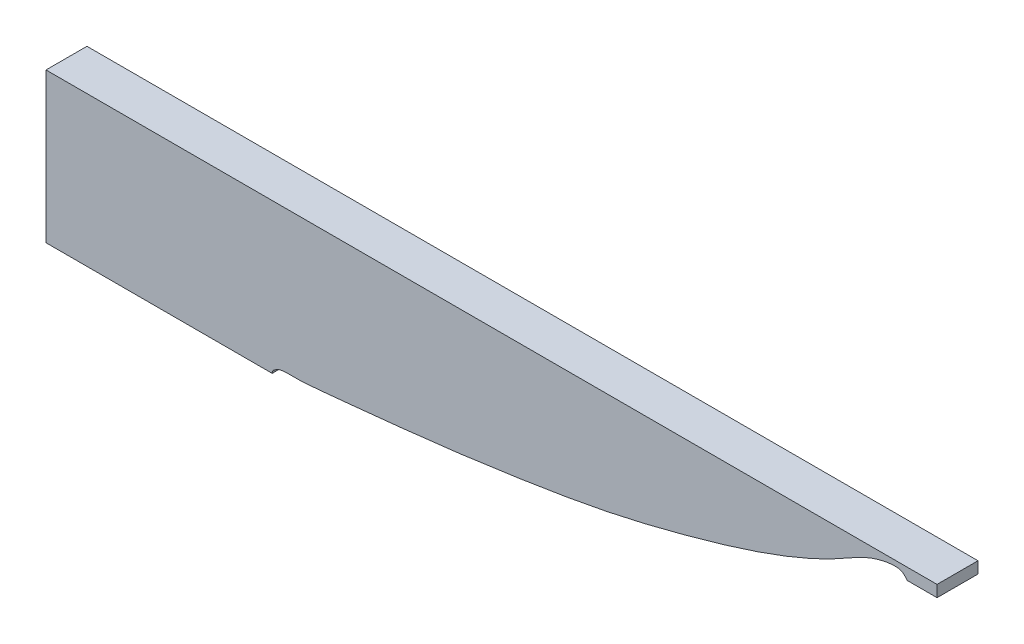
ISO-10303-21;
HEADER;
FILE_DESCRIPTION(('STEP AP214'),'2;1');
FILE_NAME('part.step','',(''),(''),'','','');
FILE_SCHEMA(('AUTOMOTIVE_DESIGN { 1 0 10303 214 1 1 1 1 }'));
ENDSEC;
DATA;
#1=APPLICATION_CONTEXT('core data for automotive mechanical design processes');
#2=APPLICATION_PROTOCOL_DEFINITION('international standard','automotive_design',2000,#1);
#3=PRODUCT_CONTEXT('',#1,'mechanical');
#4=PRODUCT('Part','Part','',(#3));
#5=PRODUCT_RELATED_PRODUCT_CATEGORY('part','',(#4));
#6=PRODUCT_DEFINITION_FORMATION('','',#4);
#7=PRODUCT_DEFINITION_CONTEXT('part definition',#1,'design');
#8=PRODUCT_DEFINITION('design','',#6,#7);
#9=PRODUCT_DEFINITION_SHAPE('','',#8);
#10=(LENGTH_UNIT() NAMED_UNIT(*) SI_UNIT(.MILLI.,.METRE.));
#11=(NAMED_UNIT(*) PLANE_ANGLE_UNIT() SI_UNIT($,.RADIAN.));
#12=(NAMED_UNIT(*) SI_UNIT($,.STERADIAN.) SOLID_ANGLE_UNIT());
#13=UNCERTAINTY_MEASURE_WITH_UNIT(LENGTH_MEASURE(1.E-05),#10,'distance_accuracy_value','');
#14=(GEOMETRIC_REPRESENTATION_CONTEXT(3) GLOBAL_UNCERTAINTY_ASSIGNED_CONTEXT((#13)) GLOBAL_UNIT_ASSIGNED_CONTEXT((#10,
#11,#12)) REPRESENTATION_CONTEXT('',''));
#15=CARTESIAN_POINT('',(0.,0.,0.));
#16=DIRECTION('',(0.,0.,1.));
#17=DIRECTION('',(1.,0.,0.));
#18=AXIS2_PLACEMENT_3D('',#15,#16,#17);
#19=CARTESIAN_POINT('',(-52.2009469096433,-26.9859590087651,364.));
#20=CARTESIAN_POINT('',(-52.2076643782362,-26.9008249066197,364.));
#21=CARTESIAN_POINT('',(-52.2086941789214,-26.8142159529312,364.));
#22=CARTESIAN_POINT('',(-52.1761840837474,-26.6463491252067,364.));
#23=CARTESIAN_POINT('',(-52.1435699097053,-26.565867128828,364.));
#24=CARTESIAN_POINT('',(-52.0478737519327,-26.4229851269886,364.));
#25=CARTESIAN_POINT('',(-51.9851315074762,-26.3646720260792,364.));
#26=CARTESIAN_POINT('',(-51.8537291223443,-26.2565926923012,364.));
#27=CARTESIAN_POINT('',(-51.7865893758686,-26.2039976291333,364.));
#28=CARTESIAN_POINT('',(-51.5828748400467,-26.0499421309684,364.));
#29=CARTESIAN_POINT('',(-51.4410393224546,-25.9545209352862,364.));
#30=CARTESIAN_POINT('',(-51.1437562383439,-25.7903210068856,364.));
#31=CARTESIAN_POINT('',(-50.9855664678437,-25.7226593943637,364.));
#32=CARTESIAN_POINT('',(-50.5049716863885,-25.5707810078762,364.));
#33=CARTESIAN_POINT('',(-50.1748740569212,-25.5269368696622,364.));
#34=CARTESIAN_POINT('',(-49.5080219460836,-25.4786417563224,364.));
#35=CARTESIAN_POINT('',(-49.1713157234657,-25.4749264661006,364.));
#36=CARTESIAN_POINT('',(-48.4997772064725,-25.4798822561327,364.));
#37=CARTESIAN_POINT('',(-48.1639561418959,-25.4876551580574,364.));
#38=CARTESIAN_POINT('',(-47.4924572665428,-25.4885592468479,364.));
#39=CARTESIAN_POINT('',(-47.1567675744337,-25.4829048034959,364.));
#40=CARTESIAN_POINT('',(-46.1498475654307,-25.4507055684768,364.));
#41=CARTESIAN_POINT('',(-45.4792809848992,-25.4076768953849,364.));
#42=CARTESIAN_POINT('',(-44.1412695498146,-25.2983938945127,364.));
#43=CARTESIAN_POINT('',(-43.4730717608353,-25.2349626686516,364.));
#44=CARTESIAN_POINT('',(-42.1366603404493,-25.1082725720015,364.));
#45=CARTESIAN_POINT('',(-41.4684526674652,-25.0449488775373,364.));
#46=CARTESIAN_POINT('',(-39.464190015059,-24.8510572458004,364.));
#47=CARTESIAN_POINT('',(-38.1284667371734,-24.7168806164181,364.));
#48=CARTESIAN_POINT('',(-31.4499466343279,-24.0449499355285,364.));
#49=CARTESIAN_POINT('',(-26.1071632718655,-23.5014581598206,364.));
#50=CARTESIAN_POINT('',(-18.1075676360533,-22.5660056416663,364.));
#51=CARTESIAN_POINT('',(-15.4437310619509,-22.2338403741593,364.));
#52=CARTESIAN_POINT('',(-10.1222376071295,-21.5228572524913,364.));
#53=CARTESIAN_POINT('',(-7.46439907946757,-21.1454107122791,364.));
#54=CARTESIAN_POINT('',(-2.15319722024847,-20.3567328692258,364.));
#55=CARTESIAN_POINT('',(0.500083871927196,-19.9457635507397,364.));
#56=CARTESIAN_POINT('',(5.79587609154246,-19.067815664953,364.));
#57=CARTESIAN_POINT('',(8.43859214387049,-18.6004356862189,364.));
#58=CARTESIAN_POINT('',(13.7071649848231,-17.573224081082,364.));
#59=CARTESIAN_POINT('',(16.3334825408524,-17.0113851140803,364.));
#60=CARTESIAN_POINT('',(21.5652701448604,-15.7956725328071,364.));
#61=CARTESIAN_POINT('',(24.1703068977647,-15.1437335534659,364.));
#62=CARTESIAN_POINT('',(29.3641519900412,-13.7739636479626,364.));
#63=CARTESIAN_POINT('',(31.9520009946092,-13.0560625476505,364.));
#64=CARTESIAN_POINT('',(37.1046529392994,-11.5405068350265,364.));
#65=CARTESIAN_POINT('',(39.6706164474642,-10.7444865759834,364.));
#66=CARTESIAN_POINT('',(43.4823857898468,-9.45961274862723,364.));
#67=CARTESIAN_POINT('',(44.7468735398583,-9.01551125780705,364.));
#68=CARTESIAN_POINT('',(47.2600944966439,-8.08648863345631,364.));
#69=CARTESIAN_POINT('',(48.5085488598233,-7.60084502287674,364.));
#70=CARTESIAN_POINT('',(50.9893147010406,-6.58773197447073,364.));
#71=CARTESIAN_POINT('',(52.222016073081,-6.06127274263022,364.));
#72=CARTESIAN_POINT('',(54.6660526064384,-4.95299494071464,364.));
#73=CARTESIAN_POINT('',(55.8779863398464,-4.37034022112138,364.));
#74=CARTESIAN_POINT('',(57.6689556813697,-3.43494085363436,364.));
#75=CARTESIAN_POINT('',(58.2611215379323,-3.11307643273593,364.));
#76=CARTESIAN_POINT('',(59.4402879964431,-2.45857080712047,364.));
#77=CARTESIAN_POINT('',(60.0266205536391,-2.12453579427306,364.));
#78=CARTESIAN_POINT('',(61.789054608586,-1.1296004237031,364.));
#79=CARTESIAN_POINT('',(62.9697310112455,-0.478245144563081,364.));
#80=CARTESIAN_POINT('',(64.8374516467542,0.297020373800566,364.));
#81=CARTESIAN_POINT('',(65.4772144302389,0.519578597777491,364.));
#82=CARTESIAN_POINT('',(66.4635631777564,0.797699531738181,364.));
#83=CARTESIAN_POINT('',(66.7977653232719,0.88164230533816,364.));
#84=CARTESIAN_POINT('',(67.4681547691546,1.02792445605697,364.));
#85=CARTESIAN_POINT('',(67.8047406347341,1.09002604287818,364.));
#86=CARTESIAN_POINT('',(68.4810493416685,1.18933557357607,364.));
#87=CARTESIAN_POINT('',(68.8206870310458,1.2272192456304,364.));
#88=CARTESIAN_POINT('',(69.3349089545761,1.24622874482237,364.));
#89=CARTESIAN_POINT('',(69.5071011835046,1.24633646032521,364.));
#90=CARTESIAN_POINT('',(69.8533450548019,1.23179641421545,364.));
#91=CARTESIAN_POINT('',(70.0256546077102,1.21659743412703,364.));
#92=CARTESIAN_POINT('',(70.3648711414067,1.15775425499039,364.));
#93=CARTESIAN_POINT('',(70.5345970729785,1.11271538482279,364.));
#94=CARTESIAN_POINT('',(70.8514927187138,0.974023223940351,364.));
#95=CARTESIAN_POINT('',(70.9944060412548,0.877911462483317,364.));
#96=CARTESIAN_POINT('',(71.2621488783253,0.655380294837213,364.));
#97=CARTESIAN_POINT('',(71.3835556524825,0.531296262824329,364.));
#98=CARTESIAN_POINT('',(71.5709954824348,0.350651163979292,364.));
#99=CARTESIAN_POINT('',(71.6337396758029,0.290707881710825,364.));
#100=CARTESIAN_POINT('',(71.7474068516063,0.15866456602323,364.));
#101=CARTESIAN_POINT('',(71.7953565909168,0.0846681168132786,364.));
#102=CARTESIAN_POINT('',(71.8181141242803,1.6716703433832E-13,364.));
#103=B_SPLINE_CURVE_WITH_KNOTS('',3,(#19,#20,#21,#22,#23,#24,#25,#26,#27,#28,#29,#30,#31,#32,
#33,#34,#35,#36,#37,#38,#39,#40,#41,#42,#43,#44,#45,#46,#47,#48,#49,#50,#51,#52,#53,#54,#55,#56,
#57,#58,#59,#60,#61,#62,#63,#64,#65,#66,#67,#68,#69,#70,#71,#72,#73,#74,#75,#76,#77,#78,#79,#80,
#81,#82,#83,#84,#85,#86,#87,#88,#89,#90,#91,#92,#93,#94,#95,#96,#97,#98,#99,#100,#101,#102),
.UNSPECIFIED.,.F.,.F.,(4,2,2,2,2,2,2,2,2,2,2,2,2,2,2,2,2,2,2,2,2,2,2,2,2,2,2,2,2,2,2,2,2,2,2,2,
2,2,2,2,2,4),(0.,0.00195312499999989,0.00390625,0.005859375,0.0078125,0.01171875,
0.0156249999999999,0.0234374999999999,0.0312499999999999,0.0390625,0.046875,0.0625,0.078125,
0.09375,0.125,0.25,0.3125,0.374999999999999,0.437499999999999,0.499999999999999,
0.562499999999999,0.624999999999999,0.687499999999999,0.749999999999999,0.781249999999999,
0.812499999999999,0.843749999999999,0.874999999999999,0.890624999999999,0.906249999999999,
0.9375,0.953124999999999,0.9609375,0.96875,0.9765625,0.98046875,0.984375,0.98828125,0.9921875,
0.99609375,0.998046875,1.),.UNSPECIFIED.);
#104=DIRECTION('',(0.,0.,-1.));
#105=VECTOR('',#104,1.);
#106=SURFACE_OF_LINEAR_EXTRUSION('',#103,#105);
#107=CARTESIAN_POINT('',(-52.2009469096433,-26.9859590087651,356.));
#108=CARTESIAN_POINT('',(-52.2076643782362,-26.9008249066197,356.));
#109=CARTESIAN_POINT('',(-52.2086941789214,-26.8142159529312,356.));
#110=CARTESIAN_POINT('',(-52.1761840837474,-26.6463491252067,356.));
#111=CARTESIAN_POINT('',(-52.1435699097053,-26.565867128828,356.));
#112=CARTESIAN_POINT('',(-52.0478737519327,-26.4229851269886,356.));
#113=CARTESIAN_POINT('',(-51.9851315074762,-26.3646720260792,356.));
#114=CARTESIAN_POINT('',(-51.8537291223443,-26.2565926923012,356.));
#115=CARTESIAN_POINT('',(-51.7865893758686,-26.2039976291333,356.));
#116=CARTESIAN_POINT('',(-51.5828748400467,-26.0499421309684,356.));
#117=CARTESIAN_POINT('',(-51.4410393224546,-25.9545209352862,356.));
#118=CARTESIAN_POINT('',(-51.1437562383439,-25.7903210068856,356.));
#119=CARTESIAN_POINT('',(-50.9855664678437,-25.7226593943637,356.));
#120=CARTESIAN_POINT('',(-50.5049716863885,-25.5707810078762,356.));
#121=CARTESIAN_POINT('',(-50.1748740569212,-25.5269368696622,356.));
#122=CARTESIAN_POINT('',(-49.5080219460836,-25.4786417563224,356.));
#123=CARTESIAN_POINT('',(-49.1713157234657,-25.4749264661006,356.));
#124=CARTESIAN_POINT('',(-48.4997772064725,-25.4798822561327,356.));
#125=CARTESIAN_POINT('',(-48.1639561418959,-25.4876551580574,356.));
#126=CARTESIAN_POINT('',(-47.4924572665428,-25.4885592468479,356.));
#127=CARTESIAN_POINT('',(-47.1567675744337,-25.4829048034959,356.));
#128=CARTESIAN_POINT('',(-46.1498475654307,-25.4507055684768,356.));
#129=CARTESIAN_POINT('',(-45.4792809848992,-25.4076768953849,356.));
#130=CARTESIAN_POINT('',(-44.1412695498146,-25.2983938945127,356.));
#131=CARTESIAN_POINT('',(-43.4730717608353,-25.2349626686516,356.));
#132=CARTESIAN_POINT('',(-42.1366603404493,-25.1082725720015,356.));
#133=CARTESIAN_POINT('',(-41.4684526674652,-25.0449488775373,356.));
#134=CARTESIAN_POINT('',(-39.464190015059,-24.8510572458004,356.));
#135=CARTESIAN_POINT('',(-38.1284667371734,-24.7168806164181,356.));
#136=CARTESIAN_POINT('',(-31.4499466343279,-24.0449499355285,356.));
#137=CARTESIAN_POINT('',(-26.1071632718655,-23.5014581598206,356.));
#138=CARTESIAN_POINT('',(-18.1075676360533,-22.5660056416663,356.));
#139=CARTESIAN_POINT('',(-15.4437310619509,-22.2338403741593,356.));
#140=CARTESIAN_POINT('',(-10.1222376071295,-21.5228572524913,356.));
#141=CARTESIAN_POINT('',(-7.46439907946757,-21.1454107122791,356.));
#142=CARTESIAN_POINT('',(-2.15319722024847,-20.3567328692258,356.));
#143=CARTESIAN_POINT('',(0.500083871927196,-19.9457635507397,356.));
#144=CARTESIAN_POINT('',(5.79587609154246,-19.067815664953,356.));
#145=CARTESIAN_POINT('',(8.43859214387049,-18.6004356862189,356.));
#146=CARTESIAN_POINT('',(13.7071649848231,-17.573224081082,356.));
#147=CARTESIAN_POINT('',(16.3334825408524,-17.0113851140803,356.));
#148=CARTESIAN_POINT('',(21.5652701448604,-15.7956725328071,356.));
#149=CARTESIAN_POINT('',(24.1703068977647,-15.1437335534659,356.));
#150=CARTESIAN_POINT('',(29.3641519900412,-13.7739636479626,356.));
#151=CARTESIAN_POINT('',(31.9520009946092,-13.0560625476505,356.));
#152=CARTESIAN_POINT('',(37.1046529392994,-11.5405068350265,356.));
#153=CARTESIAN_POINT('',(39.6706164474642,-10.7444865759834,356.));
#154=CARTESIAN_POINT('',(43.4823857898468,-9.45961274862723,356.));
#155=CARTESIAN_POINT('',(44.7468735398583,-9.01551125780705,356.));
#156=CARTESIAN_POINT('',(47.2600944966439,-8.08648863345631,356.));
#157=CARTESIAN_POINT('',(48.5085488598233,-7.60084502287674,356.));
#158=CARTESIAN_POINT('',(50.9893147010406,-6.58773197447073,356.));
#159=CARTESIAN_POINT('',(52.222016073081,-6.06127274263022,356.));
#160=CARTESIAN_POINT('',(54.6660526064384,-4.95299494071464,356.));
#161=CARTESIAN_POINT('',(55.8779863398464,-4.37034022112138,356.));
#162=CARTESIAN_POINT('',(57.6689556813697,-3.43494085363436,356.));
#163=CARTESIAN_POINT('',(58.2611215379323,-3.11307643273593,356.));
#164=CARTESIAN_POINT('',(59.4402879964431,-2.45857080712047,356.));
#165=CARTESIAN_POINT('',(60.0266205536391,-2.12453579427306,356.));
#166=CARTESIAN_POINT('',(61.789054608586,-1.1296004237031,356.));
#167=CARTESIAN_POINT('',(62.9697310112455,-0.478245144563081,356.));
#168=CARTESIAN_POINT('',(64.8374516467542,0.297020373800566,356.));
#169=CARTESIAN_POINT('',(65.4772144302389,0.519578597777491,356.));
#170=CARTESIAN_POINT('',(66.4635631777564,0.797699531738181,356.));
#171=CARTESIAN_POINT('',(66.7977653232719,0.88164230533816,356.));
#172=CARTESIAN_POINT('',(67.4681547691546,1.02792445605697,356.));
#173=CARTESIAN_POINT('',(67.8047406347341,1.09002604287818,356.));
#174=CARTESIAN_POINT('',(68.4810493416685,1.18933557357607,356.));
#175=CARTESIAN_POINT('',(68.8206870310458,1.2272192456304,356.));
#176=CARTESIAN_POINT('',(69.3349089545761,1.24622874482237,356.));
#177=CARTESIAN_POINT('',(69.5071011835046,1.24633646032521,356.));
#178=CARTESIAN_POINT('',(69.8533450548019,1.23179641421545,356.));
#179=CARTESIAN_POINT('',(70.0256546077102,1.21659743412703,356.));
#180=CARTESIAN_POINT('',(70.3648711414067,1.15775425499039,356.));
#181=CARTESIAN_POINT('',(70.5345970729785,1.11271538482279,356.));
#182=CARTESIAN_POINT('',(70.8514927187138,0.974023223940351,356.));
#183=CARTESIAN_POINT('',(70.9944060412548,0.877911462483317,356.));
#184=CARTESIAN_POINT('',(71.2621488783253,0.655380294837213,356.));
#185=CARTESIAN_POINT('',(71.3835556524825,0.531296262824329,356.));
#186=CARTESIAN_POINT('',(71.5709954824348,0.350651163979292,356.));
#187=CARTESIAN_POINT('',(71.6337396758029,0.290707881710825,356.));
#188=CARTESIAN_POINT('',(71.7474068516063,0.15866456602323,356.));
#189=CARTESIAN_POINT('',(71.7953565909168,0.0846681168132786,356.));
#190=CARTESIAN_POINT('',(71.8181141242803,1.6716703433832E-13,356.));
#191=B_SPLINE_CURVE_WITH_KNOTS('',3,(#107,#108,#109,#110,#111,#112,#113,#114,#115,#116,#117,
#118,#119,#120,#121,#122,#123,#124,#125,#126,#127,#128,#129,#130,#131,#132,#133,#134,#135,#136,
#137,#138,#139,#140,#141,#142,#143,#144,#145,#146,#147,#148,#149,#150,#151,#152,#153,#154,#155,
#156,#157,#158,#159,#160,#161,#162,#163,#164,#165,#166,#167,#168,#169,#170,#171,#172,#173,#174,
#175,#176,#177,#178,#179,#180,#181,#182,#183,#184,#185,#186,#187,#188,#189,#190),.UNSPECIFIED.,
.F.,.F.,(4,2,2,2,2,2,2,2,2,2,2,2,2,2,2,2,2,2,2,2,2,2,2,2,2,2,2,2,2,2,2,2,2,2,2,2,2,2,2,2,2,4),
(0.,0.00195312499999989,0.00390625,0.005859375,0.0078125,0.01171875,0.0156249999999999,
0.0234374999999999,0.0312499999999999,0.0390625,0.046875,0.0625,0.078125,0.09375,0.125,0.25,
0.3125,0.374999999999999,0.437499999999999,0.499999999999999,0.562499999999999,
0.624999999999999,0.687499999999999,0.749999999999999,0.781249999999999,0.812499999999999,
0.843749999999999,0.874999999999999,0.890624999999999,0.906249999999999,0.9375,
0.953124999999999,0.9609375,0.96875,0.9765625,0.98046875,0.984375,0.98828125,0.9921875,
0.99609375,0.998046875,1.),.UNSPECIFIED.);
#192=CARTESIAN_POINT('',(-52.2009469096433,-26.9859590087653,356.));
#193=VERTEX_POINT('',#192);
#194=CARTESIAN_POINT('',(71.81811412428,0.,356.));
#195=VERTEX_POINT('',#194);
#196=EDGE_CURVE('E208',#193,#195,#191,.T.);
#197=ORIENTED_EDGE('',*,*,#196,.T.);
#198=DIRECTION('',(0.,0.,-1.));
#199=VECTOR('',#198,1.);
#200=CARTESIAN_POINT('',(71.81811412428,0.,364.));
#201=LINE('',#200,#199);
#202=CARTESIAN_POINT('',(71.81811412428,0.,364.));
#203=VERTEX_POINT('',#202);
#204=EDGE_CURVE('E11',#203,#195,#201,.T.);
#205=ORIENTED_EDGE('',*,*,#204,.F.);
#206=CARTESIAN_POINT('',(71.8181141242803,1.6716703433832E-13,364.));
#207=CARTESIAN_POINT('',(71.7953565909168,0.0846681168132786,364.));
#208=CARTESIAN_POINT('',(71.7474068516063,0.15866456602323,364.));
#209=CARTESIAN_POINT('',(71.6337396758029,0.290707881710825,364.));
#210=CARTESIAN_POINT('',(71.5709954824348,0.350651163979292,364.));
#211=CARTESIAN_POINT('',(71.3835556524825,0.531296262824329,364.));
#212=CARTESIAN_POINT('',(71.2621488783253,0.655380294837213,364.));
#213=CARTESIAN_POINT('',(70.9944060412548,0.877911462483317,364.));
#214=CARTESIAN_POINT('',(70.8514927187138,0.974023223940351,364.));
#215=CARTESIAN_POINT('',(70.5345970729785,1.11271538482279,364.));
#216=CARTESIAN_POINT('',(70.3648711414067,1.15775425499039,364.));
#217=CARTESIAN_POINT('',(70.0256546077102,1.21659743412703,364.));
#218=CARTESIAN_POINT('',(69.8533450548019,1.23179641421545,364.));
#219=CARTESIAN_POINT('',(69.5071011835046,1.24633646032521,364.));
#220=CARTESIAN_POINT('',(69.3349089545761,1.24622874482237,364.));
#221=CARTESIAN_POINT('',(68.8206870310458,1.2272192456304,364.));
#222=CARTESIAN_POINT('',(68.4810493416685,1.18933557357607,364.));
#223=CARTESIAN_POINT('',(67.8047406347341,1.09002604287818,364.));
#224=CARTESIAN_POINT('',(67.4681547691546,1.02792445605697,364.));
#225=CARTESIAN_POINT('',(66.7977653232719,0.88164230533816,364.));
#226=CARTESIAN_POINT('',(66.4635631777564,0.797699531738181,364.));
#227=CARTESIAN_POINT('',(65.4772144302389,0.519578597777491,364.));
#228=CARTESIAN_POINT('',(64.8374516467542,0.297020373800566,364.));
#229=CARTESIAN_POINT('',(62.9697310112455,-0.478245144563081,364.));
#230=CARTESIAN_POINT('',(61.789054608586,-1.1296004237031,364.));
#231=CARTESIAN_POINT('',(60.0266205536391,-2.12453579427306,364.));
#232=CARTESIAN_POINT('',(59.4402879964431,-2.45857080712047,364.));
#233=CARTESIAN_POINT('',(58.2611215379323,-3.11307643273593,364.));
#234=CARTESIAN_POINT('',(57.6689556813697,-3.43494085363436,364.));
#235=CARTESIAN_POINT('',(55.8779863398464,-4.37034022112138,364.));
#236=CARTESIAN_POINT('',(54.6660526064384,-4.95299494071464,364.));
#237=CARTESIAN_POINT('',(52.222016073081,-6.06127274263022,364.));
#238=CARTESIAN_POINT('',(50.9893147010406,-6.58773197447073,364.));
#239=CARTESIAN_POINT('',(48.5085488598233,-7.60084502287674,364.));
#240=CARTESIAN_POINT('',(47.2600944966439,-8.08648863345631,364.));
#241=CARTESIAN_POINT('',(44.7468735398583,-9.01551125780705,364.));
#242=CARTESIAN_POINT('',(43.4823857898468,-9.45961274862723,364.));
#243=CARTESIAN_POINT('',(39.6706164474642,-10.7444865759834,364.));
#244=CARTESIAN_POINT('',(37.1046529392994,-11.5405068350265,364.));
#245=CARTESIAN_POINT('',(31.9520009946092,-13.0560625476505,364.));
#246=CARTESIAN_POINT('',(29.3641519900412,-13.7739636479626,364.));
#247=CARTESIAN_POINT('',(24.1703068977647,-15.1437335534659,364.));
#248=CARTESIAN_POINT('',(21.5652701448604,-15.7956725328071,364.));
#249=CARTESIAN_POINT('',(16.3334825408524,-17.0113851140803,364.));
#250=CARTESIAN_POINT('',(13.7071649848231,-17.573224081082,364.));
#251=CARTESIAN_POINT('',(8.43859214387049,-18.6004356862189,364.));
#252=CARTESIAN_POINT('',(5.79587609154246,-19.067815664953,364.));
#253=CARTESIAN_POINT('',(0.500083871927196,-19.9457635507397,364.));
#254=CARTESIAN_POINT('',(-2.15319722024847,-20.3567328692258,364.));
#255=CARTESIAN_POINT('',(-7.46439907946757,-21.1454107122791,364.));
#256=CARTESIAN_POINT('',(-10.1222376071295,-21.5228572524913,364.));
#257=CARTESIAN_POINT('',(-15.4437310619509,-22.2338403741593,364.));
#258=CARTESIAN_POINT('',(-18.1075676360533,-22.5660056416663,364.));
#259=CARTESIAN_POINT('',(-26.1071632718655,-23.5014581598206,364.));
#260=CARTESIAN_POINT('',(-31.4499466343279,-24.0449499355285,364.));
#261=CARTESIAN_POINT('',(-38.1284667371734,-24.7168806164181,364.));
#262=CARTESIAN_POINT('',(-39.464190015059,-24.8510572458004,364.));
#263=CARTESIAN_POINT('',(-41.4684526674652,-25.0449488775373,364.));
#264=CARTESIAN_POINT('',(-42.1366603404493,-25.1082725720015,364.));
#265=CARTESIAN_POINT('',(-43.4730717608353,-25.2349626686516,364.));
#266=CARTESIAN_POINT('',(-44.1412695498146,-25.2983938945127,364.));
#267=CARTESIAN_POINT('',(-45.4792809848992,-25.4076768953849,364.));
#268=CARTESIAN_POINT('',(-46.1498475654307,-25.4507055684768,364.));
#269=CARTESIAN_POINT('',(-47.1567675744337,-25.4829048034959,364.));
#270=CARTESIAN_POINT('',(-47.4924572665428,-25.4885592468479,364.));
#271=CARTESIAN_POINT('',(-48.1639561418959,-25.4876551580574,364.));
#272=CARTESIAN_POINT('',(-48.4997772064725,-25.4798822561327,364.));
#273=CARTESIAN_POINT('',(-49.1713157234657,-25.4749264661006,364.));
#274=CARTESIAN_POINT('',(-49.5080219460836,-25.4786417563224,364.));
#275=CARTESIAN_POINT('',(-50.1748740569212,-25.5269368696622,364.));
#276=CARTESIAN_POINT('',(-50.5049716863885,-25.5707810078762,364.));
#277=CARTESIAN_POINT('',(-50.9855664678437,-25.7226593943637,364.));
#278=CARTESIAN_POINT('',(-51.1437562383439,-25.7903210068856,364.));
#279=CARTESIAN_POINT('',(-51.4410393224546,-25.9545209352862,364.));
#280=CARTESIAN_POINT('',(-51.5828748400467,-26.0499421309684,364.));
#281=CARTESIAN_POINT('',(-51.7865893758686,-26.2039976291333,364.));
#282=CARTESIAN_POINT('',(-51.8537291223443,-26.2565926923012,364.));
#283=CARTESIAN_POINT('',(-51.9851315074762,-26.3646720260792,364.));
#284=CARTESIAN_POINT('',(-52.0478737519327,-26.4229851269886,364.));
#285=CARTESIAN_POINT('',(-52.1435699097053,-26.565867128828,364.));
#286=CARTESIAN_POINT('',(-52.1761840837474,-26.6463491252067,364.));
#287=CARTESIAN_POINT('',(-52.2086941789214,-26.8142159529312,364.));
#288=CARTESIAN_POINT('',(-52.2076643782362,-26.9008249066197,364.));
#289=CARTESIAN_POINT('',(-52.2009469096433,-26.9859590087651,364.));
#290=B_SPLINE_CURVE_WITH_KNOTS('',3,(#206,#207,#208,#209,#210,#211,#212,#213,#214,#215,#216,
#217,#218,#219,#220,#221,#222,#223,#224,#225,#226,#227,#228,#229,#230,#231,#232,#233,#234,#235,
#236,#237,#238,#239,#240,#241,#242,#243,#244,#245,#246,#247,#248,#249,#250,#251,#252,#253,#254,
#255,#256,#257,#258,#259,#260,#261,#262,#263,#264,#265,#266,#267,#268,#269,#270,#271,#272,#273,
#274,#275,#276,#277,#278,#279,#280,#281,#282,#283,#284,#285,#286,#287,#288,#289),.UNSPECIFIED.,
.F.,.F.,(4,2,2,2,2,2,2,2,2,2,2,2,2,2,2,2,2,2,2,2,2,2,2,2,2,2,2,2,2,2,2,2,2,2,2,2,2,2,2,2,2,4),
(0.,0.00195312499999989,0.00390624999999989,0.00781249999999989,0.01171875,0.015625,
0.0195312500000001,0.0234375000000001,0.0312500000000002,0.0390625000000004,0.0468750000000006,
0.0625000000000004,0.0937500000000007,0.109375000000001,0.125000000000001,0.156250000000001,
0.187500000000001,0.218750000000001,0.250000000000001,0.312500000000001,0.375000000000001,
0.437500000000001,0.500000000000001,0.562500000000001,0.625000000000001,0.6875,0.75,0.875,
0.90625,0.921875,0.9375,0.953125,0.9609375,0.96875,0.9765625,0.984375,0.98828125,0.9921875,
0.994140625,0.99609375,0.998046875,1.),.UNSPECIFIED.);
#291=CARTESIAN_POINT('',(-52.2009469096433,-26.9859590087653,364.));
#292=VERTEX_POINT('',#291);
#293=EDGE_CURVE('E191',#292,#203,#290,.F.);
#294=ORIENTED_EDGE('',*,*,#293,.F.);
#295=DIRECTION('',(0.,0.,-1.));
#296=VECTOR('',#295,1.);
#297=CARTESIAN_POINT('',(-52.2009469096433,-26.9859590087653,364.));
#298=LINE('',#297,#296);
#299=EDGE_CURVE('E116',#292,#193,#298,.T.);
#300=ORIENTED_EDGE('',*,*,#299,.T.);
#301=EDGE_LOOP('',(#197,#205,#294,#300));
#302=FACE_BOUND('',#301,.T.);
#303=ADVANCED_FACE('F30',(#302),#106,.F.);
#304=CARTESIAN_POINT('',(71.81811412428,0.,364.));
#305=DIRECTION('',(0.,1.,0.));
#306=DIRECTION('',(-1.,0.,0.));
#307=AXIS2_PLACEMENT_3D('',#304,#305,#306);
#308=PLANE('',#307);
#309=DIRECTION('',(1.,0.,0.));
#310=VECTOR('',#309,1.);
#311=CARTESIAN_POINT('',(71.81811412428,0.,356.));
#312=LINE('',#311,#310);
#313=CARTESIAN_POINT('',(77.6655379830616,0.,356.));
#314=VERTEX_POINT('',#313);
#315=EDGE_CURVE('E161',#195,#314,#312,.T.);
#316=ORIENTED_EDGE('',*,*,#315,.T.);
#317=DIRECTION('',(0.,0.,-1.));
#318=VECTOR('',#317,1.);
#319=CARTESIAN_POINT('',(77.6655379830616,0.,364.));
#320=LINE('',#319,#318);
#321=CARTESIAN_POINT('',(77.6655379830616,0.,364.));
#322=VERTEX_POINT('',#321);
#323=EDGE_CURVE('E41',#322,#314,#320,.T.);
#324=ORIENTED_EDGE('',*,*,#323,.F.);
#325=DIRECTION('',(1.,0.,0.));
#326=VECTOR('',#325,1.);
#327=CARTESIAN_POINT('',(71.81811412428,0.,364.));
#328=LINE('',#327,#326);
#329=EDGE_CURVE('E89',#203,#322,#328,.T.);
#330=ORIENTED_EDGE('',*,*,#329,.F.);
#331=ORIENTED_EDGE('',*,*,#204,.T.);
#332=EDGE_LOOP('',(#316,#324,#330,#331));
#333=FACE_BOUND('',#332,.T.);
#334=ADVANCED_FACE('F226',(#333),#308,.F.);
#335=CARTESIAN_POINT('',(77.6655379830616,2.25600000000005,364.));
#336=DIRECTION('',(-1.,0.,0.));
#337=DIRECTION('',(0.,0.,1.));
#338=AXIS2_PLACEMENT_3D('',#335,#336,#337);
#339=PLANE('',#338);
#340=DIRECTION('',(0.,1.,0.));
#341=VECTOR('',#340,1.);
#342=CARTESIAN_POINT('',(77.6655379830616,2.25600000000005,356.));
#343=LINE('',#342,#341);
#344=CARTESIAN_POINT('',(77.6655379830616,2.25600000000005,356.));
#345=VERTEX_POINT('',#344);
#346=EDGE_CURVE('E156',#314,#345,#343,.T.);
#347=ORIENTED_EDGE('',*,*,#346,.T.);
#348=DIRECTION('',(0.,0.,-1.));
#349=VECTOR('',#348,1.);
#350=CARTESIAN_POINT('',(77.6655379830616,2.25600000000005,364.));
#351=LINE('',#350,#349);
#352=CARTESIAN_POINT('',(77.6655379830616,2.25600000000005,364.));
#353=VERTEX_POINT('',#352);
#354=EDGE_CURVE('E111',#353,#345,#351,.T.);
#355=ORIENTED_EDGE('',*,*,#354,.F.);
#356=DIRECTION('',(0.,1.,0.));
#357=VECTOR('',#356,1.);
#358=CARTESIAN_POINT('',(77.6655379830616,2.25600000000005,364.));
#359=LINE('',#358,#357);
#360=EDGE_CURVE('E102',#322,#353,#359,.T.);
#361=ORIENTED_EDGE('',*,*,#360,.F.);
#362=ORIENTED_EDGE('',*,*,#323,.T.);
#363=EDGE_LOOP('',(#347,#355,#361,#362));
#364=FACE_BOUND('',#363,.T.);
#365=ADVANCED_FACE('F229',(#364),#339,.F.);
#366=CARTESIAN_POINT('',(77.6655379830616,2.25600000000005,364.));
#367=DIRECTION('',(0.,-1.,0.));
#368=DIRECTION('',(1.,0.,0.));
#369=AXIS2_PLACEMENT_3D('',#366,#367,#368);
#370=PLANE('',#369);
#371=DIRECTION('',(-1.,0.,0.));
#372=VECTOR('',#371,1.);
#373=CARTESIAN_POINT('',(77.6655379830616,2.25600000000005,356.));
#374=LINE('',#373,#372);
#375=CARTESIAN_POINT('',(-96.3811623776886,2.25600000000003,356.));
#376=VERTEX_POINT('',#375);
#377=EDGE_CURVE('E110',#345,#376,#374,.T.);
#378=ORIENTED_EDGE('',*,*,#377,.T.);
#379=DIRECTION('',(0.,0.,-1.));
#380=VECTOR('',#379,1.);
#381=CARTESIAN_POINT('',(-96.3811623776886,2.25600000000003,364.));
#382=LINE('',#381,#380);
#383=CARTESIAN_POINT('',(-96.3811623776886,2.25600000000003,364.));
#384=VERTEX_POINT('',#383);
#385=EDGE_CURVE('E107',#384,#376,#382,.T.);
#386=ORIENTED_EDGE('',*,*,#385,.F.);
#387=DIRECTION('',(-1.,0.,0.));
#388=VECTOR('',#387,1.);
#389=CARTESIAN_POINT('',(77.6655379830616,2.25600000000005,364.));
#390=LINE('',#389,#388);
#391=EDGE_CURVE('E96',#353,#384,#390,.T.);
#392=ORIENTED_EDGE('',*,*,#391,.F.);
#393=ORIENTED_EDGE('',*,*,#354,.T.);
#394=EDGE_LOOP('',(#378,#386,#392,#393));
#395=FACE_BOUND('',#394,.T.);
#396=ADVANCED_FACE('F108',(#395),#370,.F.);
#397=CARTESIAN_POINT('',(-96.3811623776886,-26.9829599213738,364.));
#398=DIRECTION('',(1.,0.,0.));
#399=DIRECTION('',(0.,1.,0.));
#400=AXIS2_PLACEMENT_3D('',#397,#398,#399);
#401=PLANE('',#400);
#402=DIRECTION('',(0.,-1.,0.));
#403=VECTOR('',#402,1.);
#404=CARTESIAN_POINT('',(-96.3811623776886,-26.9829599213738,356.));
#405=LINE('',#404,#403);
#406=CARTESIAN_POINT('',(-96.3811623776886,-26.9829599213738,356.));
#407=VERTEX_POINT('',#406);
#408=EDGE_CURVE('E74',#376,#407,#405,.T.);
#409=ORIENTED_EDGE('',*,*,#408,.T.);
#410=DIRECTION('',(0.,0.,-1.));
#411=VECTOR('',#410,1.);
#412=CARTESIAN_POINT('',(-96.3811623776886,-26.9829599213738,364.));
#413=LINE('',#412,#411);
#414=CARTESIAN_POINT('',(-96.3811623776886,-26.9829599213738,364.));
#415=VERTEX_POINT('',#414);
#416=EDGE_CURVE('E112',#415,#407,#413,.T.);
#417=ORIENTED_EDGE('',*,*,#416,.F.);
#418=DIRECTION('',(0.,-1.,0.));
#419=VECTOR('',#418,1.);
#420=CARTESIAN_POINT('',(-96.3811623776886,-26.9829599213738,364.));
#421=LINE('',#420,#419);
#422=EDGE_CURVE('E100',#384,#415,#421,.T.);
#423=ORIENTED_EDGE('',*,*,#422,.F.);
#424=ORIENTED_EDGE('',*,*,#385,.T.);
#425=EDGE_LOOP('',(#409,#417,#423,#424));
#426=FACE_BOUND('',#425,.T.);
#427=ADVANCED_FACE('F114',(#426),#401,.F.);
#428=CARTESIAN_POINT('',(-96.3811623776885,-26.9829599213738,364.));
#429=CARTESIAN_POINT('',(-81.6544238583573,-26.9833009416063,364.));
#430=CARTESIAN_POINT('',(-66.9276853250072,-26.9841761764902,364.));
#431=CARTESIAN_POINT('',(-52.2009469096433,-26.9859590087653,364.));
#432=B_SPLINE_CURVE_WITH_KNOTS('',3,(#428,#429,#430,#431),.UNSPECIFIED.,.F.,.F.,(4,4),(0.,1.),.UNSPECIFIED.);
#433=DIRECTION('',(0.,0.,-1.));
#434=VECTOR('',#433,1.);
#435=SURFACE_OF_LINEAR_EXTRUSION('',#432,#434);
#436=CARTESIAN_POINT('',(-96.3811623776885,-26.9829599213738,356.));
#437=CARTESIAN_POINT('',(-81.6544238583573,-26.9833009416063,356.));
#438=CARTESIAN_POINT('',(-66.9276853250072,-26.9841761764902,356.));
#439=CARTESIAN_POINT('',(-52.2009469096433,-26.9859590087653,356.));
#440=B_SPLINE_CURVE_WITH_KNOTS('',3,(#436,#437,#438,#439),.UNSPECIFIED.,.F.,.F.,(4,4),(0.,1.),.UNSPECIFIED.);
#441=EDGE_CURVE('E80',#407,#193,#440,.T.);
#442=ORIENTED_EDGE('',*,*,#441,.T.);
#443=ORIENTED_EDGE('',*,*,#299,.F.);
#444=CARTESIAN_POINT('',(-52.2009469096433,-26.9859590087653,364.));
#445=CARTESIAN_POINT('',(-66.9276853250072,-26.9841761764902,364.));
#446=CARTESIAN_POINT('',(-81.6544238583573,-26.9833009416063,364.));
#447=CARTESIAN_POINT('',(-96.3811623776885,-26.9829599213738,364.));
#448=B_SPLINE_CURVE_WITH_KNOTS('',3,(#444,#445,#446,#447),.UNSPECIFIED.,.F.,.F.,(4,4),(0.,1.),.UNSPECIFIED.);
#449=EDGE_CURVE('E50',#415,#292,#448,.F.);
#450=ORIENTED_EDGE('',*,*,#449,.F.);
#451=ORIENTED_EDGE('',*,*,#416,.T.);
#452=EDGE_LOOP('',(#442,#443,#450,#451));
#453=FACE_BOUND('',#452,.T.);
#454=ADVANCED_FACE('F135',(#453),#435,.F.);
#455=CARTESIAN_POINT('',(11.0728785643469,-18.0868298836504,364.));
#456=DIRECTION('',(0.,0.,-1.));
#457=DIRECTION('',(-1.,0.,0.));
#458=AXIS2_PLACEMENT_3D('',#455,#456,#457);
#459=PLANE('',#458);
#460=ORIENTED_EDGE('',*,*,#293,.T.);
#461=ORIENTED_EDGE('',*,*,#329,.T.);
#462=ORIENTED_EDGE('',*,*,#360,.T.);
#463=ORIENTED_EDGE('',*,*,#391,.T.);
#464=ORIENTED_EDGE('',*,*,#422,.T.);
#465=ORIENTED_EDGE('',*,*,#449,.T.);
#466=EDGE_LOOP('',(#460,#461,#462,#463,#464,#465));
#467=FACE_BOUND('',#466,.T.);
#468=ADVANCED_FACE('F98',(#467),#459,.F.);
#469=CARTESIAN_POINT('',(11.0728785643469,-18.0868298836504,356.));
#470=DIRECTION('',(0.,0.,-1.));
#471=DIRECTION('',(-1.,0.,0.));
#472=AXIS2_PLACEMENT_3D('',#469,#470,#471);
#473=PLANE('',#472);
#474=ORIENTED_EDGE('',*,*,#196,.F.);
#475=ORIENTED_EDGE('',*,*,#441,.F.);
#476=ORIENTED_EDGE('',*,*,#408,.F.);
#477=ORIENTED_EDGE('',*,*,#377,.F.);
#478=ORIENTED_EDGE('',*,*,#346,.F.);
#479=ORIENTED_EDGE('',*,*,#315,.F.);
#480=EDGE_LOOP('',(#474,#475,#476,#477,#478,#479));
#481=FACE_BOUND('',#480,.T.);
#482=ADVANCED_FACE('F146',(#481),#473,.T.);
#483=CLOSED_SHELL('',(#303,#334,#365,#396,#427,#454,#468,#482));
#484=MANIFOLD_SOLID_BREP('B2',#483);
#485=ADVANCED_BREP_SHAPE_REPRESENTATION('',(#18,#484),#14);
#486=SHAPE_DEFINITION_REPRESENTATION(#9,#485);
ENDSEC;
END-ISO-10303-21;
